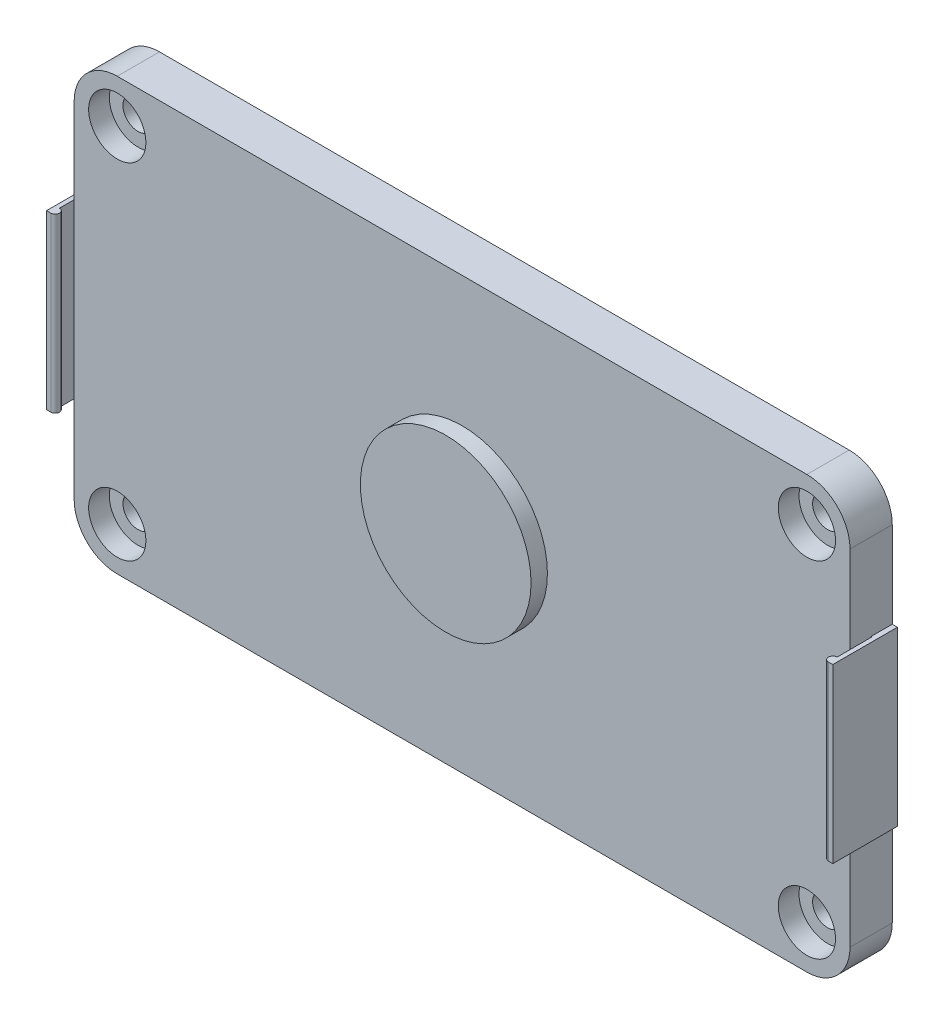
ISO-10303-21;
HEADER;
FILE_DESCRIPTION(('STEP AP214'),'2;1');
FILE_NAME('part.step','',(''),(''),'','','');
FILE_SCHEMA(('AUTOMOTIVE_DESIGN { 1 0 10303 214 1 1 1 1 }'));
ENDSEC;
DATA;
#1=APPLICATION_CONTEXT('core data for automotive mechanical design processes');
#2=APPLICATION_PROTOCOL_DEFINITION('international standard','automotive_design',2000,#1);
#3=PRODUCT_CONTEXT('',#1,'mechanical');
#4=PRODUCT('Part','Part','',(#3));
#5=PRODUCT_RELATED_PRODUCT_CATEGORY('part','',(#4));
#6=PRODUCT_DEFINITION_FORMATION('','',#4);
#7=PRODUCT_DEFINITION_CONTEXT('part definition',#1,'design');
#8=PRODUCT_DEFINITION('design','',#6,#7);
#9=PRODUCT_DEFINITION_SHAPE('','',#8);
#10=(LENGTH_UNIT() NAMED_UNIT(*) SI_UNIT(.MILLI.,.METRE.));
#11=(NAMED_UNIT(*) PLANE_ANGLE_UNIT() SI_UNIT($,.RADIAN.));
#12=(NAMED_UNIT(*) SI_UNIT($,.STERADIAN.) SOLID_ANGLE_UNIT());
#13=UNCERTAINTY_MEASURE_WITH_UNIT(LENGTH_MEASURE(1.E-05),#10,'distance_accuracy_value','');
#14=(GEOMETRIC_REPRESENTATION_CONTEXT(3) GLOBAL_UNCERTAINTY_ASSIGNED_CONTEXT((#13)) GLOBAL_UNIT_ASSIGNED_CONTEXT((#10,
#11,#12)) REPRESENTATION_CONTEXT('',''));
#15=CARTESIAN_POINT('',(0.,0.,0.));
#16=DIRECTION('',(0.,0.,1.));
#17=DIRECTION('',(1.,0.,0.));
#18=AXIS2_PLACEMENT_3D('',#15,#16,#17);
#19=CARTESIAN_POINT('',(57.15,-25.4,6.223));
#20=DIRECTION('',(-1.,0.,0.));
#21=DIRECTION('',(0.,0.,1.));
#22=AXIS2_PLACEMENT_3D('',#19,#20,#21);
#23=PLANE('',#22);
#24=DIRECTION('',(0.,0.,-1.));
#25=VECTOR('',#24,1.);
#26=CARTESIAN_POINT('',(57.15,-12.7,3.1115));
#27=LINE('',#26,#25);
#28=CARTESIAN_POINT('',(57.15,-12.7,3.1115));
#29=VERTEX_POINT('',#28);
#30=CARTESIAN_POINT('',(57.15,-12.7,0.));
#31=VERTEX_POINT('',#30);
#32=EDGE_CURVE('E276',#29,#31,#27,.T.);
#33=ORIENTED_EDGE('',*,*,#32,.F.);
#34=DIRECTION('',(0.,-1.,0.));
#35=VECTOR('',#34,1.);
#36=CARTESIAN_POINT('',(57.15,12.7,3.1115));
#37=LINE('',#36,#35);
#38=CARTESIAN_POINT('',(57.15,12.7,3.1115));
#39=VERTEX_POINT('',#38);
#40=EDGE_CURVE('E296',#39,#29,#37,.T.);
#41=ORIENTED_EDGE('',*,*,#40,.F.);
#42=DIRECTION('',(0.,0.,-1.));
#43=VECTOR('',#42,1.);
#44=CARTESIAN_POINT('',(57.15,12.7,3.1115));
#45=LINE('',#44,#43);
#46=CARTESIAN_POINT('',(57.15,12.7,0.));
#47=VERTEX_POINT('',#46);
#48=EDGE_CURVE('E288',#39,#47,#45,.T.);
#49=ORIENTED_EDGE('',*,*,#48,.T.);
#50=DIRECTION('',(0.,1.,0.));
#51=VECTOR('',#50,1.);
#52=CARTESIAN_POINT('',(57.15,-25.4,0.));
#53=LINE('',#52,#51);
#54=CARTESIAN_POINT('',(57.15,25.4,0.));
#55=VERTEX_POINT('',#54);
#56=EDGE_CURVE('E424',#47,#55,#53,.T.);
#57=ORIENTED_EDGE('',*,*,#56,.T.);
#58=DIRECTION('',(0.,0.,-1.));
#59=VECTOR('',#58,1.);
#60=CARTESIAN_POINT('',(57.15,25.4,6.223));
#61=LINE('',#60,#59);
#62=CARTESIAN_POINT('',(57.15,25.4,6.223));
#63=VERTEX_POINT('',#62);
#64=EDGE_CURVE('E53',#63,#55,#61,.T.);
#65=ORIENTED_EDGE('',*,*,#64,.F.);
#66=DIRECTION('',(0.,1.,0.));
#67=VECTOR('',#66,1.);
#68=CARTESIAN_POINT('',(57.15,-25.4,6.223));
#69=LINE('',#68,#67);
#70=CARTESIAN_POINT('',(57.15,-25.4,6.223));
#71=VERTEX_POINT('',#70);
#72=EDGE_CURVE('E398',#71,#63,#69,.T.);
#73=ORIENTED_EDGE('',*,*,#72,.F.);
#74=DIRECTION('',(0.,0.,-1.));
#75=VECTOR('',#74,1.);
#76=CARTESIAN_POINT('',(57.15,-25.4,6.223));
#77=LINE('',#76,#75);
#78=CARTESIAN_POINT('',(57.15,-25.4,0.));
#79=VERTEX_POINT('',#78);
#80=EDGE_CURVE('E11',#71,#79,#77,.T.);
#81=ORIENTED_EDGE('',*,*,#80,.T.);
#82=EDGE_CURVE('E425',#79,#31,#53,.T.);
#83=ORIENTED_EDGE('',*,*,#82,.T.);
#84=EDGE_LOOP('',(#33,#41,#49,#57,#65,#73,#81,#83));
#85=FACE_BOUND('',#84,.T.);
#86=ADVANCED_FACE('F43',(#85),#23,.F.);
#87=CARTESIAN_POINT('',(-57.15,-25.4,6.223));
#88=DIRECTION('',(1.,0.,0.));
#89=DIRECTION('',(0.,0.,-1.));
#90=AXIS2_PLACEMENT_3D('',#87,#88,#89);
#91=PLANE('',#90);
#92=DIRECTION('',(0.,0.,-1.));
#93=VECTOR('',#92,1.);
#94=CARTESIAN_POINT('',(-57.15,12.7,3.1115));
#95=LINE('',#94,#93);
#96=CARTESIAN_POINT('',(-57.15,12.7,3.1115));
#97=VERTEX_POINT('',#96);
#98=CARTESIAN_POINT('',(-57.15,12.7,0.));
#99=VERTEX_POINT('',#98);
#100=EDGE_CURVE('E340',#97,#99,#95,.T.);
#101=ORIENTED_EDGE('',*,*,#100,.F.);
#102=DIRECTION('',(0.,1.,0.));
#103=VECTOR('',#102,1.);
#104=CARTESIAN_POINT('',(-57.15,12.7,3.1115));
#105=LINE('',#104,#103);
#106=CARTESIAN_POINT('',(-57.15,-12.7,3.1115));
#107=VERTEX_POINT('',#106);
#108=EDGE_CURVE('E309',#107,#97,#105,.T.);
#109=ORIENTED_EDGE('',*,*,#108,.F.);
#110=DIRECTION('',(0.,0.,-1.));
#111=VECTOR('',#110,1.);
#112=CARTESIAN_POINT('',(-57.15,-12.7,3.1115));
#113=LINE('',#112,#111);
#114=CARTESIAN_POINT('',(-57.15,-12.7,0.));
#115=VERTEX_POINT('',#114);
#116=EDGE_CURVE('E320',#107,#115,#113,.T.);
#117=ORIENTED_EDGE('',*,*,#116,.T.);
#118=DIRECTION('',(0.,-1.,0.));
#119=VECTOR('',#118,1.);
#120=CARTESIAN_POINT('',(-57.15,-25.4,0.));
#121=LINE('',#120,#119);
#122=CARTESIAN_POINT('',(-57.15,-25.4,0.));
#123=VERTEX_POINT('',#122);
#124=EDGE_CURVE('E437',#115,#123,#121,.T.);
#125=ORIENTED_EDGE('',*,*,#124,.T.);
#126=DIRECTION('',(0.,0.,-1.));
#127=VECTOR('',#126,1.);
#128=CARTESIAN_POINT('',(-57.15,-25.4,6.223));
#129=LINE('',#128,#127);
#130=CARTESIAN_POINT('',(-57.15,-25.4,6.223));
#131=VERTEX_POINT('',#130);
#132=EDGE_CURVE('E453',#131,#123,#129,.T.);
#133=ORIENTED_EDGE('',*,*,#132,.F.);
#134=DIRECTION('',(0.,-1.,0.));
#135=VECTOR('',#134,1.);
#136=CARTESIAN_POINT('',(-57.15,-25.4,6.223));
#137=LINE('',#136,#135);
#138=CARTESIAN_POINT('',(-57.15,25.4,6.223));
#139=VERTEX_POINT('',#138);
#140=EDGE_CURVE('E411',#139,#131,#137,.T.);
#141=ORIENTED_EDGE('',*,*,#140,.F.);
#142=DIRECTION('',(0.,0.,-1.));
#143=VECTOR('',#142,1.);
#144=CARTESIAN_POINT('',(-57.15,25.4,6.223));
#145=LINE('',#144,#143);
#146=CARTESIAN_POINT('',(-57.15,25.4,0.));
#147=VERTEX_POINT('',#146);
#148=EDGE_CURVE('E457',#139,#147,#145,.T.);
#149=ORIENTED_EDGE('',*,*,#148,.T.);
#150=EDGE_CURVE('E438',#147,#99,#121,.T.);
#151=ORIENTED_EDGE('',*,*,#150,.T.);
#152=EDGE_LOOP('',(#101,#109,#117,#125,#133,#141,#149,#151));
#153=FACE_BOUND('',#152,.T.);
#154=ADVANCED_FACE('F544',(#153),#91,.F.);
#155=CARTESIAN_POINT('',(-50.8,-25.4,6.223));
#156=DIRECTION('',(0.,0.,-1.));
#157=DIRECTION('',(-1.,0.,0.));
#158=AXIS2_PLACEMENT_3D('',#155,#156,#157);
#159=CYLINDRICAL_SURFACE('',#158,2.2098);
#160=CARTESIAN_POINT('',(-50.8,-25.4,0.));
#161=DIRECTION('',(0.,0.,1.));
#162=DIRECTION('',(1.,0.,0.));
#163=AXIS2_PLACEMENT_3D('',#160,#161,#162);
#164=CIRCLE('',#163,2.2098);
#165=CARTESIAN_POINT('',(-48.5902,-25.4,0.));
#166=VERTEX_POINT('',#165);
#167=EDGE_CURVE('E389',#166,#166,#164,.T.);
#168=ORIENTED_EDGE('',*,*,#167,.F.);
#169=EDGE_LOOP('',(#168));
#170=FACE_BOUND('',#169,.T.);
#171=CARTESIAN_POINT('',(-50.8,-25.4,3.175));
#172=DIRECTION('',(0.,0.,1.));
#173=DIRECTION('',(1.,0.,0.));
#174=AXIS2_PLACEMENT_3D('',#171,#172,#173);
#175=CIRCLE('',#174,2.2098);
#176=CARTESIAN_POINT('',(-48.5902,-25.4,3.175));
#177=VERTEX_POINT('',#176);
#178=EDGE_CURVE('E47',#177,#177,#175,.T.);
#179=ORIENTED_EDGE('',*,*,#178,.T.);
#180=EDGE_LOOP('',(#179));
#181=FACE_BOUND('',#180,.T.);
#182=ADVANCED_FACE('F487',(#170,#181),#159,.F.);
#183=CARTESIAN_POINT('',(-50.8,25.4,6.223));
#184=DIRECTION('',(0.,0.,-1.));
#185=DIRECTION('',(-1.,0.,0.));
#186=AXIS2_PLACEMENT_3D('',#183,#184,#185);
#187=CYLINDRICAL_SURFACE('',#186,2.2098);
#188=CARTESIAN_POINT('',(-50.8,25.4,0.));
#189=DIRECTION('',(0.,0.,1.));
#190=DIRECTION('',(1.,0.,0.));
#191=AXIS2_PLACEMENT_3D('',#188,#189,#190);
#192=CIRCLE('',#191,2.2098);
#193=CARTESIAN_POINT('',(-48.5902,25.4,0.));
#194=VERTEX_POINT('',#193);
#195=EDGE_CURVE('E385',#194,#194,#192,.T.);
#196=ORIENTED_EDGE('',*,*,#195,.F.);
#197=EDGE_LOOP('',(#196));
#198=FACE_BOUND('',#197,.T.);
#199=CARTESIAN_POINT('',(-50.8,25.4,3.175));
#200=DIRECTION('',(0.,0.,1.));
#201=DIRECTION('',(1.,0.,0.));
#202=AXIS2_PLACEMENT_3D('',#199,#200,#201);
#203=CIRCLE('',#202,2.2098);
#204=CARTESIAN_POINT('',(-48.5902,25.4,3.175));
#205=VERTEX_POINT('',#204);
#206=EDGE_CURVE('E478',#205,#205,#203,.T.);
#207=ORIENTED_EDGE('',*,*,#206,.T.);
#208=EDGE_LOOP('',(#207));
#209=FACE_BOUND('',#208,.T.);
#210=ADVANCED_FACE('F619',(#198,#209),#187,.F.);
#211=CARTESIAN_POINT('',(50.8,25.4,6.223));
#212=DIRECTION('',(0.,0.,-1.));
#213=DIRECTION('',(-1.,0.,0.));
#214=AXIS2_PLACEMENT_3D('',#211,#212,#213);
#215=CYLINDRICAL_SURFACE('',#214,2.2098);
#216=CARTESIAN_POINT('',(50.8,25.4,0.));
#217=DIRECTION('',(0.,0.,1.));
#218=DIRECTION('',(1.,0.,0.));
#219=AXIS2_PLACEMENT_3D('',#216,#217,#218);
#220=CIRCLE('',#219,2.2098);
#221=CARTESIAN_POINT('',(53.0098,25.4,0.));
#222=VERTEX_POINT('',#221);
#223=EDGE_CURVE('E381',#222,#222,#220,.T.);
#224=ORIENTED_EDGE('',*,*,#223,.F.);
#225=EDGE_LOOP('',(#224));
#226=FACE_BOUND('',#225,.T.);
#227=CARTESIAN_POINT('',(50.8,25.4,3.175));
#228=DIRECTION('',(0.,0.,1.));
#229=DIRECTION('',(1.,0.,0.));
#230=AXIS2_PLACEMENT_3D('',#227,#228,#229);
#231=CIRCLE('',#230,2.2098);
#232=CARTESIAN_POINT('',(53.0098,25.4,3.175));
#233=VERTEX_POINT('',#232);
#234=EDGE_CURVE('E475',#233,#233,#231,.T.);
#235=ORIENTED_EDGE('',*,*,#234,.T.);
#236=EDGE_LOOP('',(#235));
#237=FACE_BOUND('',#236,.T.);
#238=ADVANCED_FACE('F623',(#226,#237),#215,.F.);
#239=CARTESIAN_POINT('',(50.8,-25.4,6.223));
#240=DIRECTION('',(0.,0.,-1.));
#241=DIRECTION('',(-1.,0.,0.));
#242=AXIS2_PLACEMENT_3D('',#239,#240,#241);
#243=CYLINDRICAL_SURFACE('',#242,2.2098);
#244=CARTESIAN_POINT('',(50.8,-25.4,0.));
#245=DIRECTION('',(0.,0.,1.));
#246=DIRECTION('',(1.,0.,0.));
#247=AXIS2_PLACEMENT_3D('',#244,#245,#246);
#248=CIRCLE('',#247,2.2098);
#249=CARTESIAN_POINT('',(53.0098,-25.4,0.));
#250=VERTEX_POINT('',#249);
#251=EDGE_CURVE('E377',#250,#250,#248,.T.);
#252=ORIENTED_EDGE('',*,*,#251,.F.);
#253=EDGE_LOOP('',(#252));
#254=FACE_BOUND('',#253,.T.);
#255=CARTESIAN_POINT('',(50.8,-25.4,3.175));
#256=DIRECTION('',(0.,0.,1.));
#257=DIRECTION('',(1.,0.,0.));
#258=AXIS2_PLACEMENT_3D('',#255,#256,#257);
#259=CIRCLE('',#258,2.2098);
#260=CARTESIAN_POINT('',(53.0098,-25.4,3.175));
#261=VERTEX_POINT('',#260);
#262=EDGE_CURVE('E373',#261,#261,#259,.T.);
#263=ORIENTED_EDGE('',*,*,#262,.T.);
#264=EDGE_LOOP('',(#263));
#265=FACE_BOUND('',#264,.T.);
#266=ADVANCED_FACE('F507',(#254,#265),#243,.F.);
#267=CARTESIAN_POINT('',(50.8,-25.4,6.223));
#268=DIRECTION('',(0.,0.,1.));
#269=DIRECTION('',(1.,0.,0.));
#270=AXIS2_PLACEMENT_3D('',#267,#268,#269);
#271=PLANE('',#270);
#272=CARTESIAN_POINT('',(0.,0.,6.223));
#273=DIRECTION('',(0.,0.,1.));
#274=DIRECTION('',(1.,0.,0.));
#275=AXIS2_PLACEMENT_3D('',#272,#273,#274);
#276=CIRCLE('',#275,12.573);
#277=CARTESIAN_POINT('',(12.573,0.,6.223));
#278=VERTEX_POINT('',#277);
#279=EDGE_CURVE('E1015',#278,#278,#276,.T.);
#280=ORIENTED_EDGE('',*,*,#279,.F.);
#281=EDGE_LOOP('',(#280));
#282=FACE_BOUND('',#281,.T.);
#283=CARTESIAN_POINT('',(-50.8,-25.4,6.223));
#284=DIRECTION('',(0.,0.,1.));
#285=DIRECTION('',(1.,0.,0.));
#286=AXIS2_PLACEMENT_3D('',#283,#284,#285);
#287=CIRCLE('',#286,4.2164);
#288=CARTESIAN_POINT('',(-46.5836,-25.4,6.223));
#289=VERTEX_POINT('',#288);
#290=EDGE_CURVE('E362',#289,#289,#287,.T.);
#291=ORIENTED_EDGE('',*,*,#290,.F.);
#292=EDGE_LOOP('',(#291));
#293=FACE_BOUND('',#292,.T.);
#294=CARTESIAN_POINT('',(50.8,-25.4,6.223));
#295=DIRECTION('',(0.,0.,1.));
#296=DIRECTION('',(1.,0.,0.));
#297=AXIS2_PLACEMENT_3D('',#294,#295,#296);
#298=CIRCLE('',#297,4.2164);
#299=CARTESIAN_POINT('',(55.0164,-25.4,6.223));
#300=VERTEX_POINT('',#299);
#301=EDGE_CURVE('E354',#300,#300,#298,.T.);
#302=ORIENTED_EDGE('',*,*,#301,.F.);
#303=EDGE_LOOP('',(#302));
#304=FACE_BOUND('',#303,.T.);
#305=CARTESIAN_POINT('',(50.8,25.4,6.223));
#306=DIRECTION('',(0.,0.,1.));
#307=DIRECTION('',(1.,0.,0.));
#308=AXIS2_PLACEMENT_3D('',#305,#306,#307);
#309=CIRCLE('',#308,4.2164);
#310=CARTESIAN_POINT('',(55.0164,25.4,6.223));
#311=VERTEX_POINT('',#310);
#312=EDGE_CURVE('E345',#311,#311,#309,.T.);
#313=ORIENTED_EDGE('',*,*,#312,.F.);
#314=EDGE_LOOP('',(#313));
#315=FACE_BOUND('',#314,.T.);
#316=CARTESIAN_POINT('',(-50.8,25.4,6.223));
#317=DIRECTION('',(0.,0.,1.));
#318=DIRECTION('',(1.,0.,0.));
#319=AXIS2_PLACEMENT_3D('',#316,#317,#318);
#320=CIRCLE('',#319,4.2164);
#321=CARTESIAN_POINT('',(-46.5836,25.4,6.223));
#322=VERTEX_POINT('',#321);
#323=EDGE_CURVE('E349',#322,#322,#320,.T.);
#324=ORIENTED_EDGE('',*,*,#323,.F.);
#325=EDGE_LOOP('',(#324));
#326=FACE_BOUND('',#325,.T.);
#327=CARTESIAN_POINT('',(50.8,-25.4,6.223));
#328=DIRECTION('',(0.,0.,1.));
#329=DIRECTION('',(1.,0.,0.));
#330=AXIS2_PLACEMENT_3D('',#327,#328,#329);
#331=CIRCLE('',#330,6.34999999999999);
#332=CARTESIAN_POINT('',(50.8,-31.75,6.223));
#333=VERTEX_POINT('',#332);
#334=EDGE_CURVE('E394',#333,#71,#331,.T.);
#335=ORIENTED_EDGE('',*,*,#334,.T.);
#336=ORIENTED_EDGE('',*,*,#72,.T.);
#337=CARTESIAN_POINT('',(50.8,25.4,6.223));
#338=DIRECTION('',(0.,0.,1.));
#339=DIRECTION('',(-1.,0.,0.));
#340=AXIS2_PLACEMENT_3D('',#337,#338,#339);
#341=CIRCLE('',#340,6.35);
#342=CARTESIAN_POINT('',(50.8,31.75,6.223));
#343=VERTEX_POINT('',#342);
#344=EDGE_CURVE('E402',#63,#343,#341,.T.);
#345=ORIENTED_EDGE('',*,*,#344,.T.);
#346=DIRECTION('',(-1.,0.,0.));
#347=VECTOR('',#346,1.);
#348=CARTESIAN_POINT('',(-50.8,31.75,6.223));
#349=LINE('',#348,#347);
#350=CARTESIAN_POINT('',(-50.8,31.75,6.223));
#351=VERTEX_POINT('',#350);
#352=EDGE_CURVE('E405',#343,#351,#349,.T.);
#353=ORIENTED_EDGE('',*,*,#352,.T.);
#354=CARTESIAN_POINT('',(-50.8,25.4,6.223));
#355=DIRECTION('',(0.,0.,1.));
#356=DIRECTION('',(-1.,0.,0.));
#357=AXIS2_PLACEMENT_3D('',#354,#355,#356);
#358=CIRCLE('',#357,6.35);
#359=EDGE_CURVE('E408',#351,#139,#358,.T.);
#360=ORIENTED_EDGE('',*,*,#359,.T.);
#361=ORIENTED_EDGE('',*,*,#140,.T.);
#362=CARTESIAN_POINT('',(-50.8,-25.4,6.223));
#363=DIRECTION('',(0.,0.,1.));
#364=DIRECTION('',(-1.,0.,0.));
#365=AXIS2_PLACEMENT_3D('',#362,#363,#364);
#366=CIRCLE('',#365,6.34999999999999);
#367=CARTESIAN_POINT('',(-50.8,-31.75,6.223));
#368=VERTEX_POINT('',#367);
#369=EDGE_CURVE('E414',#131,#368,#366,.T.);
#370=ORIENTED_EDGE('',*,*,#369,.T.);
#371=DIRECTION('',(1.,0.,0.));
#372=VECTOR('',#371,1.);
#373=CARTESIAN_POINT('',(-50.8,-31.75,6.223));
#374=LINE('',#373,#372);
#375=EDGE_CURVE('E417',#368,#333,#374,.T.);
#376=ORIENTED_EDGE('',*,*,#375,.T.);
#377=EDGE_LOOP('',(#335,#336,#345,#353,#360,#361,#370,#376));
#378=FACE_BOUND('',#377,.T.);
#379=ADVANCED_FACE('F503',(#282,#293,#304,#315,#326,#378),#271,.T.);
#380=CARTESIAN_POINT('',(50.8,-25.4,0.));
#381=DIRECTION('',(0.,0.,1.));
#382=DIRECTION('',(1.,0.,0.));
#383=AXIS2_PLACEMENT_3D('',#380,#381,#382);
#384=PLANE('',#383);
#385=CARTESIAN_POINT('',(50.8,-25.4,0.));
#386=DIRECTION('',(0.,0.,1.));
#387=DIRECTION('',(1.,0.,0.));
#388=AXIS2_PLACEMENT_3D('',#385,#386,#387);
#389=CIRCLE('',#388,6.34999999999999);
#390=CARTESIAN_POINT('',(50.8,-31.75,0.));
#391=VERTEX_POINT('',#390);
#392=EDGE_CURVE('E393',#391,#79,#389,.T.);
#393=ORIENTED_EDGE('',*,*,#392,.F.);
#394=DIRECTION('',(1.,0.,0.));
#395=VECTOR('',#394,1.);
#396=CARTESIAN_POINT('',(-50.8,-31.75,0.));
#397=LINE('',#396,#395);
#398=CARTESIAN_POINT('',(-50.8,-31.75,0.));
#399=VERTEX_POINT('',#398);
#400=EDGE_CURVE('E399',#399,#391,#397,.T.);
#401=ORIENTED_EDGE('',*,*,#400,.F.);
#402=CARTESIAN_POINT('',(-50.8,-25.4,0.));
#403=DIRECTION('',(0.,0.,1.));
#404=DIRECTION('',(-1.,0.,0.));
#405=AXIS2_PLACEMENT_3D('',#402,#403,#404);
#406=CIRCLE('',#405,6.34999999999999);
#407=EDGE_CURVE('E441',#123,#399,#406,.T.);
#408=ORIENTED_EDGE('',*,*,#407,.F.);
#409=ORIENTED_EDGE('',*,*,#124,.F.);
#410=DIRECTION('',(1.,0.,0.));
#411=VECTOR('',#410,1.);
#412=CARTESIAN_POINT('',(-57.15,-12.7,0.));
#413=LINE('',#412,#411);
#414=CARTESIAN_POINT('',(-57.912,-12.7,0.));
#415=VERTEX_POINT('',#414);
#416=EDGE_CURVE('E314',#415,#115,#413,.T.);
#417=ORIENTED_EDGE('',*,*,#416,.F.);
#418=DIRECTION('',(0.,-1.,0.));
#419=VECTOR('',#418,1.);
#420=CARTESIAN_POINT('',(-57.912,12.7,0.));
#421=LINE('',#420,#419);
#422=CARTESIAN_POINT('',(-57.912,12.7,0.));
#423=VERTEX_POINT('',#422);
#424=EDGE_CURVE('E323',#423,#415,#421,.T.);
#425=ORIENTED_EDGE('',*,*,#424,.F.);
#426=DIRECTION('',(-1.,0.,0.));
#427=VECTOR('',#426,1.);
#428=CARTESIAN_POINT('',(-57.15,12.7,0.));
#429=LINE('',#428,#427);
#430=EDGE_CURVE('E302',#99,#423,#429,.T.);
#431=ORIENTED_EDGE('',*,*,#430,.F.);
#432=ORIENTED_EDGE('',*,*,#150,.F.);
#433=CARTESIAN_POINT('',(-50.8,25.4,0.));
#434=DIRECTION('',(0.,0.,1.));
#435=DIRECTION('',(-1.,0.,0.));
#436=AXIS2_PLACEMENT_3D('',#433,#434,#435);
#437=CIRCLE('',#436,6.35);
#438=CARTESIAN_POINT('',(-50.8,31.75,0.));
#439=VERTEX_POINT('',#438);
#440=EDGE_CURVE('E434',#439,#147,#437,.T.);
#441=ORIENTED_EDGE('',*,*,#440,.F.);
#442=DIRECTION('',(-1.,0.,0.));
#443=VECTOR('',#442,1.);
#444=CARTESIAN_POINT('',(-50.8,31.75,0.));
#445=LINE('',#444,#443);
#446=CARTESIAN_POINT('',(50.8,31.75,0.));
#447=VERTEX_POINT('',#446);
#448=EDGE_CURVE('E431',#447,#439,#445,.T.);
#449=ORIENTED_EDGE('',*,*,#448,.F.);
#450=CARTESIAN_POINT('',(50.8,25.4,0.));
#451=DIRECTION('',(0.,0.,1.));
#452=DIRECTION('',(-1.,0.,0.));
#453=AXIS2_PLACEMENT_3D('',#450,#451,#452);
#454=CIRCLE('',#453,6.35);
#455=EDGE_CURVE('E428',#55,#447,#454,.T.);
#456=ORIENTED_EDGE('',*,*,#455,.F.);
#457=ORIENTED_EDGE('',*,*,#56,.F.);
#458=DIRECTION('',(-1.,0.,0.));
#459=VECTOR('',#458,1.);
#460=CARTESIAN_POINT('',(57.15,12.7,0.));
#461=LINE('',#460,#459);
#462=CARTESIAN_POINT('',(57.912,12.7,0.));
#463=VERTEX_POINT('',#462);
#464=EDGE_CURVE('E292',#463,#47,#461,.T.);
#465=ORIENTED_EDGE('',*,*,#464,.F.);
#466=DIRECTION('',(0.,1.,0.));
#467=VECTOR('',#466,1.);
#468=CARTESIAN_POINT('',(57.912,12.7,0.));
#469=LINE('',#468,#467);
#470=CARTESIAN_POINT('',(57.912,-12.7,0.));
#471=VERTEX_POINT('',#470);
#472=EDGE_CURVE('E295',#471,#463,#469,.T.);
#473=ORIENTED_EDGE('',*,*,#472,.F.);
#474=DIRECTION('',(1.,0.,0.));
#475=VECTOR('',#474,1.);
#476=CARTESIAN_POINT('',(57.15,-12.7,0.));
#477=LINE('',#476,#475);
#478=EDGE_CURVE('E299',#31,#471,#477,.T.);
#479=ORIENTED_EDGE('',*,*,#478,.F.);
#480=ORIENTED_EDGE('',*,*,#82,.F.);
#481=EDGE_LOOP('',(#393,#401,#408,#409,#417,#425,#431,#432,#441,#449,#456,#457,#465,#473,#479,#480));
#482=FACE_BOUND('',#481,.T.);
#483=ORIENTED_EDGE('',*,*,#167,.T.);
#484=EDGE_LOOP('',(#483));
#485=FACE_BOUND('',#484,.T.);
#486=ORIENTED_EDGE('',*,*,#195,.T.);
#487=EDGE_LOOP('',(#486));
#488=FACE_BOUND('',#487,.T.);
#489=ORIENTED_EDGE('',*,*,#223,.T.);
#490=EDGE_LOOP('',(#489));
#491=FACE_BOUND('',#490,.T.);
#492=ORIENTED_EDGE('',*,*,#251,.T.);
#493=EDGE_LOOP('',(#492));
#494=FACE_BOUND('',#493,.T.);
#495=ADVANCED_FACE('F506',(#482,#485,#488,#491,#494),#384,.F.);
#496=CARTESIAN_POINT('',(50.8,-25.4,6.223));
#497=DIRECTION('',(0.,0.,-1.));
#498=DIRECTION('',(-1.,0.,0.));
#499=AXIS2_PLACEMENT_3D('',#496,#497,#498);
#500=CYLINDRICAL_SURFACE('',#499,6.34999999999999);
#501=ORIENTED_EDGE('',*,*,#392,.T.);
#502=ORIENTED_EDGE('',*,*,#80,.F.);
#503=ORIENTED_EDGE('',*,*,#334,.F.);
#504=DIRECTION('',(0.,0.,-1.));
#505=VECTOR('',#504,1.);
#506=CARTESIAN_POINT('',(50.8,-31.75,6.223));
#507=LINE('',#506,#505);
#508=EDGE_CURVE('E420',#333,#391,#507,.T.);
#509=ORIENTED_EDGE('',*,*,#508,.T.);
#510=EDGE_LOOP('',(#501,#502,#503,#509));
#511=FACE_BOUND('',#510,.T.);
#512=ADVANCED_FACE('F45',(#511),#500,.T.);
#513=CARTESIAN_POINT('',(50.8,25.4,6.223));
#514=DIRECTION('',(0.,0.,-1.));
#515=DIRECTION('',(-1.,0.,0.));
#516=AXIS2_PLACEMENT_3D('',#513,#514,#515);
#517=CYLINDRICAL_SURFACE('',#516,6.35);
#518=ORIENTED_EDGE('',*,*,#455,.T.);
#519=DIRECTION('',(0.,0.,-1.));
#520=VECTOR('',#519,1.);
#521=CARTESIAN_POINT('',(50.8,31.75,6.223));
#522=LINE('',#521,#520);
#523=EDGE_CURVE('E465',#343,#447,#522,.T.);
#524=ORIENTED_EDGE('',*,*,#523,.F.);
#525=ORIENTED_EDGE('',*,*,#344,.F.);
#526=ORIENTED_EDGE('',*,*,#64,.T.);
#527=EDGE_LOOP('',(#518,#524,#525,#526));
#528=FACE_BOUND('',#527,.T.);
#529=ADVANCED_FACE('F529',(#528),#517,.T.);
#530=CARTESIAN_POINT('',(-50.8,31.75,6.223));
#531=DIRECTION('',(0.,-1.,0.));
#532=DIRECTION('',(0.,0.,-1.));
#533=AXIS2_PLACEMENT_3D('',#530,#531,#532);
#534=PLANE('',#533);
#535=ORIENTED_EDGE('',*,*,#448,.T.);
#536=DIRECTION('',(0.,0.,-1.));
#537=VECTOR('',#536,1.);
#538=CARTESIAN_POINT('',(-50.8,31.75,6.223));
#539=LINE('',#538,#537);
#540=EDGE_CURVE('E461',#351,#439,#539,.T.);
#541=ORIENTED_EDGE('',*,*,#540,.F.);
#542=ORIENTED_EDGE('',*,*,#352,.F.);
#543=ORIENTED_EDGE('',*,*,#523,.T.);
#544=EDGE_LOOP('',(#535,#541,#542,#543));
#545=FACE_BOUND('',#544,.T.);
#546=ADVANCED_FACE('F535',(#545),#534,.F.);
#547=CARTESIAN_POINT('',(-50.8,25.4,6.223));
#548=DIRECTION('',(0.,0.,-1.));
#549=DIRECTION('',(-1.,0.,0.));
#550=AXIS2_PLACEMENT_3D('',#547,#548,#549);
#551=CYLINDRICAL_SURFACE('',#550,6.35);
#552=ORIENTED_EDGE('',*,*,#440,.T.);
#553=ORIENTED_EDGE('',*,*,#148,.F.);
#554=ORIENTED_EDGE('',*,*,#359,.F.);
#555=ORIENTED_EDGE('',*,*,#540,.T.);
#556=EDGE_LOOP('',(#552,#553,#554,#555));
#557=FACE_BOUND('',#556,.T.);
#558=ADVANCED_FACE('F539',(#557),#551,.T.);
#559=CARTESIAN_POINT('',(-50.8,-25.4,6.223));
#560=DIRECTION('',(0.,0.,-1.));
#561=DIRECTION('',(-1.,0.,0.));
#562=AXIS2_PLACEMENT_3D('',#559,#560,#561);
#563=CYLINDRICAL_SURFACE('',#562,6.34999999999999);
#564=ORIENTED_EDGE('',*,*,#407,.T.);
#565=DIRECTION('',(0.,0.,-1.));
#566=VECTOR('',#565,1.);
#567=CARTESIAN_POINT('',(-50.8,-31.75,6.223));
#568=LINE('',#567,#566);
#569=EDGE_CURVE('E449',#368,#399,#568,.T.);
#570=ORIENTED_EDGE('',*,*,#569,.F.);
#571=ORIENTED_EDGE('',*,*,#369,.F.);
#572=ORIENTED_EDGE('',*,*,#132,.T.);
#573=EDGE_LOOP('',(#564,#570,#571,#572));
#574=FACE_BOUND('',#573,.T.);
#575=ADVANCED_FACE('F548',(#574),#563,.T.);
#576=CARTESIAN_POINT('',(-50.8,-31.75,6.223));
#577=DIRECTION('',(0.,1.,0.));
#578=DIRECTION('',(0.,0.,1.));
#579=AXIS2_PLACEMENT_3D('',#576,#577,#578);
#580=PLANE('',#579);
#581=ORIENTED_EDGE('',*,*,#400,.T.);
#582=ORIENTED_EDGE('',*,*,#508,.F.);
#583=ORIENTED_EDGE('',*,*,#375,.F.);
#584=ORIENTED_EDGE('',*,*,#569,.T.);
#585=EDGE_LOOP('',(#581,#582,#583,#584));
#586=FACE_BOUND('',#585,.T.);
#587=ADVANCED_FACE('F552',(#586),#580,.F.);
#588=CARTESIAN_POINT('',(50.8,-25.4,3.175));
#589=DIRECTION('',(0.,0.,1.));
#590=DIRECTION('',(1.,0.,0.));
#591=AXIS2_PLACEMENT_3D('',#588,#589,#590);
#592=CYLINDRICAL_SURFACE('',#591,4.2164);
#593=CARTESIAN_POINT('',(50.8,-25.4,3.175));
#594=DIRECTION('',(0.,0.,1.));
#595=DIRECTION('',(1.,0.,0.));
#596=AXIS2_PLACEMENT_3D('',#593,#594,#595);
#597=CIRCLE('',#596,4.2164);
#598=CARTESIAN_POINT('',(55.0164,-25.4,3.175));
#599=VERTEX_POINT('',#598);
#600=EDGE_CURVE('E358',#599,#599,#597,.T.);
#601=ORIENTED_EDGE('',*,*,#600,.F.);
#602=EDGE_LOOP('',(#601));
#603=FACE_BOUND('',#602,.T.);
#604=ORIENTED_EDGE('',*,*,#301,.T.);
#605=EDGE_LOOP('',(#604));
#606=FACE_BOUND('',#605,.T.);
#607=ADVANCED_FACE('F614',(#603,#606),#592,.F.);
#608=CARTESIAN_POINT('',(50.8,-25.4,3.175));
#609=DIRECTION('',(0.,0.,1.));
#610=DIRECTION('',(1.,0.,0.));
#611=AXIS2_PLACEMENT_3D('',#608,#609,#610);
#612=PLANE('',#611);
#613=ORIENTED_EDGE('',*,*,#262,.F.);
#614=EDGE_LOOP('',(#613));
#615=FACE_BOUND('',#614,.T.);
#616=ORIENTED_EDGE('',*,*,#600,.T.);
#617=EDGE_LOOP('',(#616));
#618=FACE_BOUND('',#617,.T.);
#619=ADVANCED_FACE('F639',(#615,#618),#612,.T.);
#620=CARTESIAN_POINT('',(50.8,25.4,3.175));
#621=DIRECTION('',(0.,0.,1.));
#622=DIRECTION('',(1.,0.,0.));
#623=AXIS2_PLACEMENT_3D('',#620,#621,#622);
#624=CYLINDRICAL_SURFACE('',#623,4.2164);
#625=CARTESIAN_POINT('',(50.8,25.4,3.175));
#626=DIRECTION('',(0.,0.,1.));
#627=DIRECTION('',(1.,0.,0.));
#628=AXIS2_PLACEMENT_3D('',#625,#626,#627);
#629=CIRCLE('',#628,4.2164);
#630=CARTESIAN_POINT('',(55.0164,25.4,3.175));
#631=VERTEX_POINT('',#630);
#632=EDGE_CURVE('E350',#631,#631,#629,.T.);
#633=ORIENTED_EDGE('',*,*,#632,.F.);
#634=EDGE_LOOP('',(#633));
#635=FACE_BOUND('',#634,.T.);
#636=ORIENTED_EDGE('',*,*,#312,.T.);
#637=EDGE_LOOP('',(#636));
#638=FACE_BOUND('',#637,.T.);
#639=ADVANCED_FACE('F642',(#635,#638),#624,.F.);
#640=CARTESIAN_POINT('',(50.8,25.4,3.175));
#641=DIRECTION('',(0.,0.,1.));
#642=DIRECTION('',(1.,0.,0.));
#643=AXIS2_PLACEMENT_3D('',#640,#641,#642);
#644=PLANE('',#643);
#645=ORIENTED_EDGE('',*,*,#234,.F.);
#646=EDGE_LOOP('',(#645));
#647=FACE_BOUND('',#646,.T.);
#648=ORIENTED_EDGE('',*,*,#632,.T.);
#649=EDGE_LOOP('',(#648));
#650=FACE_BOUND('',#649,.T.);
#651=ADVANCED_FACE('F634',(#647,#650),#644,.T.);
#652=CARTESIAN_POINT('',(-50.8,25.4,3.175));
#653=DIRECTION('',(0.,0.,1.));
#654=DIRECTION('',(1.,0.,0.));
#655=AXIS2_PLACEMENT_3D('',#652,#653,#654);
#656=CYLINDRICAL_SURFACE('',#655,4.2164);
#657=CARTESIAN_POINT('',(-50.8,25.4,3.175));
#658=DIRECTION('',(0.,0.,1.));
#659=DIRECTION('',(1.,0.,0.));
#660=AXIS2_PLACEMENT_3D('',#657,#658,#659);
#661=CIRCLE('',#660,4.2164);
#662=CARTESIAN_POINT('',(-46.5836,25.4,3.175));
#663=VERTEX_POINT('',#662);
#664=EDGE_CURVE('E369',#663,#663,#661,.T.);
#665=ORIENTED_EDGE('',*,*,#664,.F.);
#666=EDGE_LOOP('',(#665));
#667=FACE_BOUND('',#666,.T.);
#668=ORIENTED_EDGE('',*,*,#323,.T.);
#669=EDGE_LOOP('',(#668));
#670=FACE_BOUND('',#669,.T.);
#671=ADVANCED_FACE('F631',(#667,#670),#656,.F.);
#672=CARTESIAN_POINT('',(-50.8,25.4,3.175));
#673=DIRECTION('',(0.,0.,1.));
#674=DIRECTION('',(1.,0.,0.));
#675=AXIS2_PLACEMENT_3D('',#672,#673,#674);
#676=PLANE('',#675);
#677=ORIENTED_EDGE('',*,*,#206,.F.);
#678=EDGE_LOOP('',(#677));
#679=FACE_BOUND('',#678,.T.);
#680=ORIENTED_EDGE('',*,*,#664,.T.);
#681=EDGE_LOOP('',(#680));
#682=FACE_BOUND('',#681,.T.);
#683=ADVANCED_FACE('F499',(#679,#682),#676,.T.);
#684=CARTESIAN_POINT('',(-50.8,-25.4,3.175));
#685=DIRECTION('',(0.,0.,1.));
#686=DIRECTION('',(1.,0.,0.));
#687=AXIS2_PLACEMENT_3D('',#684,#685,#686);
#688=CYLINDRICAL_SURFACE('',#687,4.2164);
#689=CARTESIAN_POINT('',(-50.8,-25.4,3.175));
#690=DIRECTION('',(0.,0.,1.));
#691=DIRECTION('',(1.,0.,0.));
#692=AXIS2_PLACEMENT_3D('',#689,#690,#691);
#693=CIRCLE('',#692,4.2164);
#694=CARTESIAN_POINT('',(-46.5836,-25.4,3.175));
#695=VERTEX_POINT('',#694);
#696=EDGE_CURVE('E344',#695,#695,#693,.T.);
#697=ORIENTED_EDGE('',*,*,#696,.F.);
#698=EDGE_LOOP('',(#697));
#699=FACE_BOUND('',#698,.T.);
#700=ORIENTED_EDGE('',*,*,#290,.T.);
#701=EDGE_LOOP('',(#700));
#702=FACE_BOUND('',#701,.T.);
#703=ADVANCED_FACE('F493',(#699,#702),#688,.F.);
#704=CARTESIAN_POINT('',(-50.8,-25.4,3.175));
#705=DIRECTION('',(0.,0.,1.));
#706=DIRECTION('',(1.,0.,0.));
#707=AXIS2_PLACEMENT_3D('',#704,#705,#706);
#708=PLANE('',#707);
#709=ORIENTED_EDGE('',*,*,#178,.F.);
#710=EDGE_LOOP('',(#709));
#711=FACE_BOUND('',#710,.T.);
#712=ORIENTED_EDGE('',*,*,#696,.T.);
#713=EDGE_LOOP('',(#712));
#714=FACE_BOUND('',#713,.T.);
#715=ADVANCED_FACE('F489',(#711,#714),#708,.T.);
#716=CARTESIAN_POINT('',(-57.15,12.7,3.1115));
#717=DIRECTION('',(0.,-1.,0.));
#718=DIRECTION('',(1.,0.,0.));
#719=AXIS2_PLACEMENT_3D('',#716,#717,#718);
#720=PLANE('',#719);
#721=ORIENTED_EDGE('',*,*,#430,.T.);
#722=DIRECTION('',(0.,0.,-1.));
#723=VECTOR('',#722,1.);
#724=CARTESIAN_POINT('',(-57.912,12.7,3.1115));
#725=LINE('',#724,#723);
#726=CARTESIAN_POINT('',(-57.912,12.7,9.525));
#727=VERTEX_POINT('',#726);
#728=EDGE_CURVE('E336',#727,#423,#725,.T.);
#729=ORIENTED_EDGE('',*,*,#728,.F.);
#730=DIRECTION('',(1.,0.,0.));
#731=VECTOR('',#730,1.);
#732=CARTESIAN_POINT('',(-57.912,12.7,9.525));
#733=LINE('',#732,#731);
#734=CARTESIAN_POINT('',(-57.277,12.7,9.525));
#735=VERTEX_POINT('',#734);
#736=EDGE_CURVE('E243',#727,#735,#733,.T.);
#737=ORIENTED_EDGE('',*,*,#736,.T.);
#738=CARTESIAN_POINT('',(-57.277,12.7,8.89));
#739=DIRECTION('',(0.,-1.,0.));
#740=DIRECTION('',(1.,0.,0.));
#741=AXIS2_PLACEMENT_3D('',#738,#739,#740);
#742=CIRCLE('',#741,0.634999999999998);
#743=CARTESIAN_POINT('',(-57.277,12.7,8.255));
#744=VERTEX_POINT('',#743);
#745=EDGE_CURVE('E250',#735,#744,#742,.F.);
#746=ORIENTED_EDGE('',*,*,#745,.T.);
#747=DIRECTION('',(0.,0.,-1.));
#748=VECTOR('',#747,1.);
#749=CARTESIAN_POINT('',(-57.277,12.7,8.255));
#750=LINE('',#749,#748);
#751=CARTESIAN_POINT('',(-57.277,12.7,3.1115));
#752=VERTEX_POINT('',#751);
#753=EDGE_CURVE('E246',#744,#752,#750,.T.);
#754=ORIENTED_EDGE('',*,*,#753,.T.);
#755=DIRECTION('',(-1.,0.,0.));
#756=VECTOR('',#755,1.);
#757=CARTESIAN_POINT('',(-57.15,12.7,3.1115));
#758=LINE('',#757,#756);
#759=EDGE_CURVE('E313',#97,#752,#758,.T.);
#760=ORIENTED_EDGE('',*,*,#759,.F.);
#761=ORIENTED_EDGE('',*,*,#100,.T.);
#762=EDGE_LOOP('',(#721,#729,#737,#746,#754,#760,#761));
#763=FACE_BOUND('',#762,.T.);
#764=ADVANCED_FACE('F492',(#763),#720,.F.);
#765=CARTESIAN_POINT('',(-57.912,12.7,3.1115));
#766=DIRECTION('',(1.,0.,0.));
#767=DIRECTION('',(0.,0.,-1.));
#768=AXIS2_PLACEMENT_3D('',#765,#766,#767);
#769=PLANE('',#768);
#770=ORIENTED_EDGE('',*,*,#424,.T.);
#771=DIRECTION('',(0.,0.,-1.));
#772=VECTOR('',#771,1.);
#773=CARTESIAN_POINT('',(-57.912,-12.7,3.1115));
#774=LINE('',#773,#772);
#775=CARTESIAN_POINT('',(-57.912,-12.7000000000001,9.525));
#776=VERTEX_POINT('',#775);
#777=EDGE_CURVE('E332',#776,#415,#774,.T.);
#778=ORIENTED_EDGE('',*,*,#777,.F.);
#779=DIRECTION('',(0.,-1.,0.));
#780=VECTOR('',#779,1.);
#781=CARTESIAN_POINT('',(-57.912,19.2380335155158,9.525));
#782=LINE('',#781,#780);
#783=EDGE_CURVE('E265',#727,#776,#782,.T.);
#784=ORIENTED_EDGE('',*,*,#783,.F.);
#785=ORIENTED_EDGE('',*,*,#728,.T.);
#786=EDGE_LOOP('',(#770,#778,#784,#785));
#787=FACE_BOUND('',#786,.T.);
#788=ADVANCED_FACE('F572',(#787),#769,.F.);
#789=CARTESIAN_POINT('',(-57.15,-12.7,3.1115));
#790=DIRECTION('',(0.,1.,0.));
#791=DIRECTION('',(-1.,0.,0.));
#792=AXIS2_PLACEMENT_3D('',#789,#790,#791);
#793=PLANE('',#792);
#794=ORIENTED_EDGE('',*,*,#416,.T.);
#795=ORIENTED_EDGE('',*,*,#116,.F.);
#796=DIRECTION('',(1.,0.,0.));
#797=VECTOR('',#796,1.);
#798=CARTESIAN_POINT('',(-57.15,-12.7,3.1115));
#799=LINE('',#798,#797);
#800=CARTESIAN_POINT('',(-57.277,-12.7,3.1115));
#801=VERTEX_POINT('',#800);
#802=EDGE_CURVE('E317',#801,#107,#799,.T.);
#803=ORIENTED_EDGE('',*,*,#802,.F.);
#804=DIRECTION('',(0.,0.,1.));
#805=VECTOR('',#804,1.);
#806=CARTESIAN_POINT('',(-57.277,-12.7000000000001,8.255));
#807=LINE('',#806,#805);
#808=CARTESIAN_POINT('',(-57.277,-12.7000000000001,8.255));
#809=VERTEX_POINT('',#808);
#810=EDGE_CURVE('E241',#801,#809,#807,.T.);
#811=ORIENTED_EDGE('',*,*,#810,.T.);
#812=CARTESIAN_POINT('',(-57.277,-12.7000000000001,8.89));
#813=DIRECTION('',(0.,-1.,0.));
#814=DIRECTION('',(-1.,0.,0.));
#815=AXIS2_PLACEMENT_3D('',#812,#813,#814);
#816=CIRCLE('',#815,0.634999999999998);
#817=CARTESIAN_POINT('',(-57.277,-12.7000000000001,9.525));
#818=VERTEX_POINT('',#817);
#819=EDGE_CURVE('E254',#809,#818,#816,.T.);
#820=ORIENTED_EDGE('',*,*,#819,.T.);
#821=DIRECTION('',(-1.,0.,0.));
#822=VECTOR('',#821,1.);
#823=CARTESIAN_POINT('',(-57.912,-12.7000000000001,9.525));
#824=LINE('',#823,#822);
#825=EDGE_CURVE('E258',#818,#776,#824,.T.);
#826=ORIENTED_EDGE('',*,*,#825,.T.);
#827=ORIENTED_EDGE('',*,*,#777,.T.);
#828=EDGE_LOOP('',(#794,#795,#803,#811,#820,#826,#827));
#829=FACE_BOUND('',#828,.T.);
#830=ADVANCED_FACE('F568',(#829),#793,.F.);
#831=CARTESIAN_POINT('',(0.,0.,3.1115));
#832=DIRECTION('',(0.,0.,-1.));
#833=DIRECTION('',(-1.,0.,0.));
#834=AXIS2_PLACEMENT_3D('',#831,#832,#833);
#835=PLANE('',#834);
#836=ORIENTED_EDGE('',*,*,#759,.T.);
#837=DIRECTION('',(0.,-1.,0.));
#838=VECTOR('',#837,1.);
#839=CARTESIAN_POINT('',(-57.277,19.2380335155158,3.1115));
#840=LINE('',#839,#838);
#841=EDGE_CURVE('E69',#752,#801,#840,.T.);
#842=ORIENTED_EDGE('',*,*,#841,.T.);
#843=ORIENTED_EDGE('',*,*,#802,.T.);
#844=ORIENTED_EDGE('',*,*,#108,.T.);
#845=EDGE_LOOP('',(#836,#842,#843,#844));
#846=FACE_BOUND('',#845,.T.);
#847=ADVANCED_FACE('F581',(#846),#835,.F.);
#848=CARTESIAN_POINT('',(57.15,-12.7,3.1115));
#849=DIRECTION('',(0.,1.,0.));
#850=DIRECTION('',(-1.,0.,0.));
#851=AXIS2_PLACEMENT_3D('',#848,#849,#850);
#852=PLANE('',#851);
#853=ORIENTED_EDGE('',*,*,#478,.T.);
#854=DIRECTION('',(0.,0.,-1.));
#855=VECTOR('',#854,1.);
#856=CARTESIAN_POINT('',(57.912,-12.7,3.1115));
#857=LINE('',#856,#855);
#858=CARTESIAN_POINT('',(57.912,-12.7000000000002,9.525));
#859=VERTEX_POINT('',#858);
#860=EDGE_CURVE('E280',#859,#471,#857,.T.);
#861=ORIENTED_EDGE('',*,*,#860,.F.);
#862=DIRECTION('',(-1.,0.,0.));
#863=VECTOR('',#862,1.);
#864=CARTESIAN_POINT('',(57.912,-12.7000000000002,9.525));
#865=LINE('',#864,#863);
#866=CARTESIAN_POINT('',(57.277,-12.7000000000002,9.525));
#867=VERTEX_POINT('',#866);
#868=EDGE_CURVE('E238',#859,#867,#865,.T.);
#869=ORIENTED_EDGE('',*,*,#868,.T.);
#870=CARTESIAN_POINT('',(57.277,-12.7000000000002,8.89));
#871=DIRECTION('',(0.,-1.,0.));
#872=DIRECTION('',(1.,0.,0.));
#873=AXIS2_PLACEMENT_3D('',#870,#871,#872);
#874=CIRCLE('',#873,0.634999999999998);
#875=CARTESIAN_POINT('',(57.277,-12.7000000000002,8.255));
#876=VERTEX_POINT('',#875);
#877=EDGE_CURVE('E235',#867,#876,#874,.T.);
#878=ORIENTED_EDGE('',*,*,#877,.T.);
#879=DIRECTION('',(0.,0.,-1.));
#880=VECTOR('',#879,1.);
#881=CARTESIAN_POINT('',(57.277,-12.7000000000002,8.255));
#882=LINE('',#881,#880);
#883=CARTESIAN_POINT('',(57.277,-12.7,3.1115));
#884=VERTEX_POINT('',#883);
#885=EDGE_CURVE('E222',#876,#884,#882,.T.);
#886=ORIENTED_EDGE('',*,*,#885,.T.);
#887=DIRECTION('',(1.,0.,0.));
#888=VECTOR('',#887,1.);
#889=CARTESIAN_POINT('',(57.15,-12.7,3.1115));
#890=LINE('',#889,#888);
#891=EDGE_CURVE('E61',#29,#884,#890,.T.);
#892=ORIENTED_EDGE('',*,*,#891,.F.);
#893=ORIENTED_EDGE('',*,*,#32,.T.);
#894=EDGE_LOOP('',(#853,#861,#869,#878,#886,#892,#893));
#895=FACE_BOUND('',#894,.T.);
#896=ADVANCED_FACE('F558',(#895),#852,.F.);
#897=CARTESIAN_POINT('',(57.912,12.7,3.1115));
#898=DIRECTION('',(-1.,0.,0.));
#899=DIRECTION('',(0.,0.,1.));
#900=AXIS2_PLACEMENT_3D('',#897,#898,#899);
#901=PLANE('',#900);
#902=ORIENTED_EDGE('',*,*,#472,.T.);
#903=DIRECTION('',(0.,0.,-1.));
#904=VECTOR('',#903,1.);
#905=CARTESIAN_POINT('',(57.912,12.7,3.1115));
#906=LINE('',#905,#904);
#907=CARTESIAN_POINT('',(57.912,12.7000000000005,9.525));
#908=VERTEX_POINT('',#907);
#909=EDGE_CURVE('E284',#908,#463,#906,.T.);
#910=ORIENTED_EDGE('',*,*,#909,.F.);
#911=DIRECTION('',(0.,-1.,0.));
#912=VECTOR('',#911,1.);
#913=CARTESIAN_POINT('',(57.912,19.2380335155157,9.525));
#914=LINE('',#913,#912);
#915=EDGE_CURVE('E228',#908,#859,#914,.T.);
#916=ORIENTED_EDGE('',*,*,#915,.T.);
#917=ORIENTED_EDGE('',*,*,#860,.T.);
#918=EDGE_LOOP('',(#902,#910,#916,#917));
#919=FACE_BOUND('',#918,.T.);
#920=ADVANCED_FACE('F666',(#919),#901,.F.);
#921=CARTESIAN_POINT('',(57.15,12.7,3.1115));
#922=DIRECTION('',(0.,-1.,0.));
#923=DIRECTION('',(1.,0.,0.));
#924=AXIS2_PLACEMENT_3D('',#921,#922,#923);
#925=PLANE('',#924);
#926=ORIENTED_EDGE('',*,*,#464,.T.);
#927=ORIENTED_EDGE('',*,*,#48,.F.);
#928=DIRECTION('',(-1.,0.,0.));
#929=VECTOR('',#928,1.);
#930=CARTESIAN_POINT('',(57.15,12.7,3.1115));
#931=LINE('',#930,#929);
#932=CARTESIAN_POINT('',(57.277,12.7000000000005,3.1115));
#933=VERTEX_POINT('',#932);
#934=EDGE_CURVE('E204',#933,#39,#931,.T.);
#935=ORIENTED_EDGE('',*,*,#934,.F.);
#936=DIRECTION('',(0.,0.,1.));
#937=VECTOR('',#936,1.);
#938=CARTESIAN_POINT('',(57.277,12.7000000000005,8.255));
#939=LINE('',#938,#937);
#940=CARTESIAN_POINT('',(57.277,12.7000000000005,8.255));
#941=VERTEX_POINT('',#940);
#942=EDGE_CURVE('E196',#933,#941,#939,.T.);
#943=ORIENTED_EDGE('',*,*,#942,.T.);
#944=CARTESIAN_POINT('',(57.277,12.7000000000005,8.89));
#945=DIRECTION('',(0.,-1.,0.));
#946=DIRECTION('',(1.,0.,0.));
#947=AXIS2_PLACEMENT_3D('',#944,#945,#946);
#948=CIRCLE('',#947,0.634999999999998);
#949=CARTESIAN_POINT('',(57.277,12.7000000000005,9.525));
#950=VERTEX_POINT('',#949);
#951=EDGE_CURVE('E201',#941,#950,#948,.F.);
#952=ORIENTED_EDGE('',*,*,#951,.T.);
#953=DIRECTION('',(1.,0.,0.));
#954=VECTOR('',#953,1.);
#955=CARTESIAN_POINT('',(57.912,12.7000000000005,9.525));
#956=LINE('',#955,#954);
#957=EDGE_CURVE('E208',#950,#908,#956,.T.);
#958=ORIENTED_EDGE('',*,*,#957,.T.);
#959=ORIENTED_EDGE('',*,*,#909,.T.);
#960=EDGE_LOOP('',(#926,#927,#935,#943,#952,#958,#959));
#961=FACE_BOUND('',#960,.T.);
#962=ADVANCED_FACE('F199',(#961),#925,.F.);
#963=CARTESIAN_POINT('',(0.,0.,3.1115));
#964=DIRECTION('',(0.,0.,1.));
#965=DIRECTION('',(1.,0.,0.));
#966=AXIS2_PLACEMENT_3D('',#963,#964,#965);
#967=PLANE('',#966);
#968=DIRECTION('',(0.,-1.,0.));
#969=VECTOR('',#968,1.);
#970=CARTESIAN_POINT('',(57.277,19.2380335155157,3.1115));
#971=LINE('',#970,#969);
#972=EDGE_CURVE('E218',#933,#884,#971,.T.);
#973=ORIENTED_EDGE('',*,*,#972,.F.);
#974=ORIENTED_EDGE('',*,*,#934,.T.);
#975=ORIENTED_EDGE('',*,*,#40,.T.);
#976=ORIENTED_EDGE('',*,*,#891,.T.);
#977=EDGE_LOOP('',(#973,#974,#975,#976));
#978=FACE_BOUND('',#977,.T.);
#979=ADVANCED_FACE('F661',(#978),#967,.T.);
#980=CARTESIAN_POINT('',(-57.277,19.2380335155158,8.255));
#981=DIRECTION('',(1.,0.,0.));
#982=DIRECTION('',(0.,1.,0.));
#983=AXIS2_PLACEMENT_3D('',#980,#981,#982);
#984=PLANE('',#983);
#985=ORIENTED_EDGE('',*,*,#753,.F.);
#986=DIRECTION('',(0.,-1.,0.));
#987=VECTOR('',#986,1.);
#988=CARTESIAN_POINT('',(-57.277,19.2380335155158,8.255));
#989=LINE('',#988,#987);
#990=EDGE_CURVE('E262',#744,#809,#989,.T.);
#991=ORIENTED_EDGE('',*,*,#990,.T.);
#992=ORIENTED_EDGE('',*,*,#810,.F.);
#993=ORIENTED_EDGE('',*,*,#841,.F.);
#994=EDGE_LOOP('',(#985,#991,#992,#993));
#995=FACE_BOUND('',#994,.T.);
#996=ADVANCED_FACE('F584',(#995),#984,.T.);
#997=CARTESIAN_POINT('',(-57.912,19.2380335155158,9.525));
#998=DIRECTION('',(0.,0.,1.));
#999=DIRECTION('',(1.,0.,0.));
#1000=AXIS2_PLACEMENT_3D('',#997,#998,#999);
#1001=PLANE('',#1000);
#1002=ORIENTED_EDGE('',*,*,#736,.F.);
#1003=ORIENTED_EDGE('',*,*,#783,.T.);
#1004=ORIENTED_EDGE('',*,*,#825,.F.);
#1005=DIRECTION('',(0.,-1.,0.));
#1006=VECTOR('',#1005,1.);
#1007=CARTESIAN_POINT('',(-57.277,19.2380335155158,9.525));
#1008=LINE('',#1007,#1006);
#1009=EDGE_CURVE('E269',#735,#818,#1008,.T.);
#1010=ORIENTED_EDGE('',*,*,#1009,.F.);
#1011=EDGE_LOOP('',(#1002,#1003,#1004,#1010));
#1012=FACE_BOUND('',#1011,.T.);
#1013=ADVANCED_FACE('F575',(#1012),#1001,.T.);
#1014=CARTESIAN_POINT('',(-57.277,19.2380335155158,8.89));
#1015=DIRECTION('',(0.,-1.,0.));
#1016=DIRECTION('',(1.,0.,0.));
#1017=AXIS2_PLACEMENT_3D('',#1014,#1015,#1016);
#1018=CYLINDRICAL_SURFACE('',#1017,0.634999999999998);
#1019=ORIENTED_EDGE('',*,*,#745,.F.);
#1020=ORIENTED_EDGE('',*,*,#1009,.T.);
#1021=ORIENTED_EDGE('',*,*,#819,.F.);
#1022=ORIENTED_EDGE('',*,*,#990,.F.);
#1023=EDGE_LOOP('',(#1019,#1020,#1021,#1022));
#1024=FACE_BOUND('',#1023,.T.);
#1025=ADVANCED_FACE('F588',(#1024),#1018,.T.);
#1026=CARTESIAN_POINT('',(57.277,19.2380335155157,8.255));
#1027=DIRECTION('',(-1.,0.,0.));
#1028=DIRECTION('',(0.,-1.,0.));
#1029=AXIS2_PLACEMENT_3D('',#1026,#1027,#1028);
#1030=PLANE('',#1029);
#1031=ORIENTED_EDGE('',*,*,#942,.F.);
#1032=ORIENTED_EDGE('',*,*,#972,.T.);
#1033=ORIENTED_EDGE('',*,*,#885,.F.);
#1034=DIRECTION('',(0.,-1.,0.));
#1035=VECTOR('',#1034,1.);
#1036=CARTESIAN_POINT('',(57.277,19.2380335155157,8.255));
#1037=LINE('',#1036,#1035);
#1038=EDGE_CURVE('E213',#941,#876,#1037,.T.);
#1039=ORIENTED_EDGE('',*,*,#1038,.F.);
#1040=EDGE_LOOP('',(#1031,#1032,#1033,#1039));
#1041=FACE_BOUND('',#1040,.T.);
#1042=ADVANCED_FACE('F220',(#1041),#1030,.T.);
#1043=CARTESIAN_POINT('',(57.277,19.2380335155157,8.89));
#1044=DIRECTION('',(0.,-1.,0.));
#1045=DIRECTION('',(1.,0.,0.));
#1046=AXIS2_PLACEMENT_3D('',#1043,#1044,#1045);
#1047=CYLINDRICAL_SURFACE('',#1046,0.634999999999998);
#1048=ORIENTED_EDGE('',*,*,#951,.F.);
#1049=ORIENTED_EDGE('',*,*,#1038,.T.);
#1050=ORIENTED_EDGE('',*,*,#877,.F.);
#1051=DIRECTION('',(0.,-1.,0.));
#1052=VECTOR('',#1051,1.);
#1053=CARTESIAN_POINT('',(57.277,19.2380335155157,9.525));
#1054=LINE('',#1053,#1052);
#1055=EDGE_CURVE('E215',#950,#867,#1054,.T.);
#1056=ORIENTED_EDGE('',*,*,#1055,.F.);
#1057=EDGE_LOOP('',(#1048,#1049,#1050,#1056));
#1058=FACE_BOUND('',#1057,.T.);
#1059=ADVANCED_FACE('F211',(#1058),#1047,.T.);
#1060=CARTESIAN_POINT('',(57.912,19.2380335155157,9.525));
#1061=DIRECTION('',(0.,0.,1.));
#1062=DIRECTION('',(1.,0.,0.));
#1063=AXIS2_PLACEMENT_3D('',#1060,#1061,#1062);
#1064=PLANE('',#1063);
#1065=ORIENTED_EDGE('',*,*,#957,.F.);
#1066=ORIENTED_EDGE('',*,*,#1055,.T.);
#1067=ORIENTED_EDGE('',*,*,#868,.F.);
#1068=ORIENTED_EDGE('',*,*,#915,.F.);
#1069=EDGE_LOOP('',(#1065,#1066,#1067,#1068));
#1070=FACE_BOUND('',#1069,.T.);
#1071=ADVANCED_FACE('F702',(#1070),#1064,.T.);
#1072=CARTESIAN_POINT('',(0.,0.,8.636));
#1073=DIRECTION('',(0.,0.,-1.));
#1074=DIRECTION('',(-1.,0.,0.));
#1075=AXIS2_PLACEMENT_3D('',#1072,#1073,#1074);
#1076=CYLINDRICAL_SURFACE('',#1075,12.573);
#1077=CARTESIAN_POINT('',(0.,0.,8.636));
#1078=DIRECTION('',(0.,0.,1.));
#1079=DIRECTION('',(1.,0.,0.));
#1080=AXIS2_PLACEMENT_3D('',#1077,#1078,#1079);
#1081=CIRCLE('',#1080,12.573);
#1082=CARTESIAN_POINT('',(12.573,0.,8.636));
#1083=VERTEX_POINT('',#1082);
#1084=EDGE_CURVE('E1013',#1083,#1083,#1081,.T.);
#1085=ORIENTED_EDGE('',*,*,#1084,.F.);
#1086=EDGE_LOOP('',(#1085));
#1087=FACE_BOUND('',#1086,.T.);
#1088=ORIENTED_EDGE('',*,*,#279,.T.);
#1089=EDGE_LOOP('',(#1088));
#1090=FACE_BOUND('',#1089,.T.);
#1091=ADVANCED_FACE('F711',(#1087,#1090),#1076,.T.);
#1092=CARTESIAN_POINT('',(0.,0.,8.636));
#1093=DIRECTION('',(0.,0.,1.));
#1094=DIRECTION('',(1.,0.,0.));
#1095=AXIS2_PLACEMENT_3D('',#1092,#1093,#1094);
#1096=PLANE('',#1095);
#1097=ORIENTED_EDGE('',*,*,#1084,.T.);
#1098=EDGE_LOOP('',(#1097));
#1099=FACE_BOUND('',#1098,.T.);
#1100=ADVANCED_FACE('F727',(#1099),#1096,.T.);
#1101=CLOSED_SHELL('',(#86,#154,#182,#210,#238,#266,#379,#495,#512,#529,#546,#558,#575,#587,
#607,#619,#639,#651,#671,#683,#703,#715,#764,#788,#830,#847,#896,#920,#962,#979,#996,#1013,
#1025,#1042,#1059,#1071,#1091,#1100));
#1102=MANIFOLD_SOLID_BREP('B2',#1101);
#1103=ADVANCED_BREP_SHAPE_REPRESENTATION('',(#18,#1102),#14);
#1104=SHAPE_DEFINITION_REPRESENTATION(#9,#1103);
ENDSEC;
END-ISO-10303-21;
